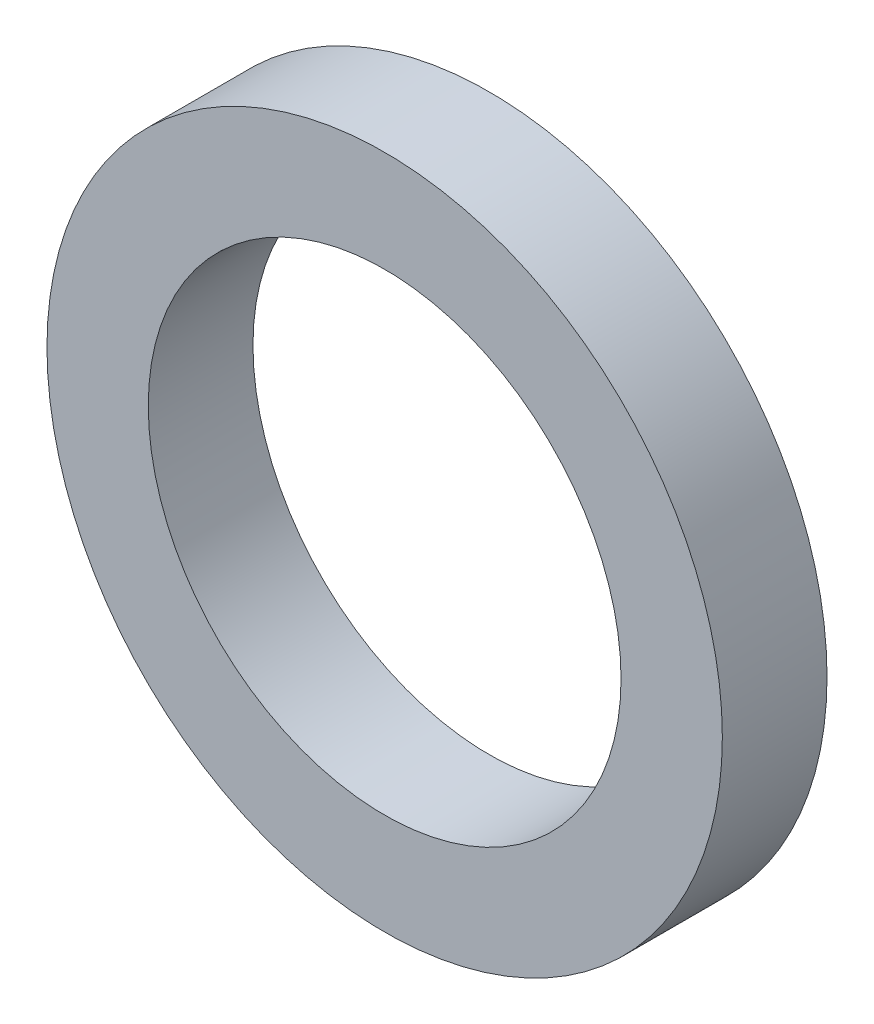
ISO-10303-21;
HEADER;
FILE_DESCRIPTION(('STEP AP214'),'2;1');
FILE_NAME('part.step','',(''),(''),'','','');
FILE_SCHEMA(('AUTOMOTIVE_DESIGN { 1 0 10303 214 1 1 1 1 }'));
ENDSEC;
DATA;
#1=APPLICATION_CONTEXT('core data for automotive mechanical design processes');
#2=APPLICATION_PROTOCOL_DEFINITION('international standard','automotive_design',2000,#1);
#3=PRODUCT_CONTEXT('',#1,'mechanical');
#4=PRODUCT('Part','Part','',(#3));
#5=PRODUCT_RELATED_PRODUCT_CATEGORY('part','',(#4));
#6=PRODUCT_DEFINITION_FORMATION('','',#4);
#7=PRODUCT_DEFINITION_CONTEXT('part definition',#1,'design');
#8=PRODUCT_DEFINITION('design','',#6,#7);
#9=PRODUCT_DEFINITION_SHAPE('','',#8);
#10=(LENGTH_UNIT() NAMED_UNIT(*) SI_UNIT(.MILLI.,.METRE.));
#11=(NAMED_UNIT(*) PLANE_ANGLE_UNIT() SI_UNIT($,.RADIAN.));
#12=(NAMED_UNIT(*) SI_UNIT($,.STERADIAN.) SOLID_ANGLE_UNIT());
#13=UNCERTAINTY_MEASURE_WITH_UNIT(LENGTH_MEASURE(1.E-05),#10,'distance_accuracy_value','');
#14=(GEOMETRIC_REPRESENTATION_CONTEXT(3) GLOBAL_UNCERTAINTY_ASSIGNED_CONTEXT((#13)) GLOBAL_UNIT_ASSIGNED_CONTEXT((#10,
#11,#12)) REPRESENTATION_CONTEXT('',''));
#15=CARTESIAN_POINT('',(0.,0.,0.));
#16=DIRECTION('',(0.,0.,1.));
#17=DIRECTION('',(1.,0.,0.));
#18=AXIS2_PLACEMENT_3D('',#15,#16,#17);
#19=CARTESIAN_POINT('',(0.,0.,3.1));
#20=DIRECTION('',(0.,0.,1.));
#21=DIRECTION('',(1.,0.,0.));
#22=AXIS2_PLACEMENT_3D('',#19,#20,#21);
#23=PLANE('',#22);
#24=CARTESIAN_POINT('',(0.,0.,3.1));
#25=DIRECTION('',(0.,0.,1.));
#26=DIRECTION('',(1.,0.,0.));
#27=AXIS2_PLACEMENT_3D('',#24,#25,#26);
#28=CIRCLE('',#27,20.);
#29=CARTESIAN_POINT('',(-20.,0.,3.1));
#30=VERTEX_POINT('',#29);
#31=EDGE_CURVE('E10',#30,#30,#28,.T.);
#32=ORIENTED_EDGE('',*,*,#31,.T.);
#33=EDGE_LOOP('',(#32));
#34=FACE_BOUND('',#33,.T.);
#35=CARTESIAN_POINT('',(0.,0.,3.1));
#36=DIRECTION('',(0.,0.,1.));
#37=DIRECTION('',(1.,0.,0.));
#38=AXIS2_PLACEMENT_3D('',#35,#36,#37);
#39=CIRCLE('',#38,14.);
#40=CARTESIAN_POINT('',(-14.,0.,3.1));
#41=VERTEX_POINT('',#40);
#42=EDGE_CURVE('E43',#41,#41,#39,.T.);
#43=ORIENTED_EDGE('',*,*,#42,.F.);
#44=EDGE_LOOP('',(#43));
#45=FACE_BOUND('',#44,.T.);
#46=ADVANCED_FACE('F32',(#34,#45),#23,.T.);
#47=CARTESIAN_POINT('',(0.,0.,-3.1));
#48=DIRECTION('',(0.,0.,1.));
#49=DIRECTION('',(1.,0.,0.));
#50=AXIS2_PLACEMENT_3D('',#47,#48,#49);
#51=PLANE('',#50);
#52=CARTESIAN_POINT('',(0.,0.,-3.1));
#53=DIRECTION('',(0.,0.,1.));
#54=DIRECTION('',(1.,0.,0.));
#55=AXIS2_PLACEMENT_3D('',#52,#53,#54);
#56=CIRCLE('',#55,20.);
#57=CARTESIAN_POINT('',(-20.,0.,-3.1));
#58=VERTEX_POINT('',#57);
#59=EDGE_CURVE('E36',#58,#58,#56,.T.);
#60=ORIENTED_EDGE('',*,*,#59,.F.);
#61=EDGE_LOOP('',(#60));
#62=FACE_BOUND('',#61,.T.);
#63=CARTESIAN_POINT('',(0.,0.,-3.1));
#64=DIRECTION('',(0.,0.,1.));
#65=DIRECTION('',(1.,0.,0.));
#66=AXIS2_PLACEMENT_3D('',#63,#64,#65);
#67=CIRCLE('',#66,14.);
#68=CARTESIAN_POINT('',(-14.,0.,-3.1));
#69=VERTEX_POINT('',#68);
#70=EDGE_CURVE('E45',#69,#69,#67,.T.);
#71=ORIENTED_EDGE('',*,*,#70,.T.);
#72=EDGE_LOOP('',(#71));
#73=FACE_BOUND('',#72,.T.);
#74=ADVANCED_FACE('F55',(#62,#73),#51,.F.);
#75=CARTESIAN_POINT('',(0.,0.,3.1));
#76=DIRECTION('',(0.,0.,-1.));
#77=DIRECTION('',(-1.,0.,0.));
#78=AXIS2_PLACEMENT_3D('',#75,#76,#77);
#79=CYLINDRICAL_SURFACE('',#78,20.);
#80=CARTESIAN_POINT('',(-20.,0.,3.1));
#81=CARTESIAN_POINT('',(-20.,0.,3.03541666666667));
#82=CARTESIAN_POINT('',(-20.,0.,2.97083333333333));
#83=CARTESIAN_POINT('',(-20.,0.,2.84166666666667));
#84=CARTESIAN_POINT('',(-20.,0.,2.77708333333333));
#85=CARTESIAN_POINT('',(-20.,0.,2.64791666666667));
#86=CARTESIAN_POINT('',(-20.,0.,2.58333333333333));
#87=CARTESIAN_POINT('',(-20.,0.,2.45416666666667));
#88=CARTESIAN_POINT('',(-20.,0.,2.38958333333333));
#89=CARTESIAN_POINT('',(-20.,0.,2.26041666666667));
#90=CARTESIAN_POINT('',(-20.,0.,2.19583333333333));
#91=CARTESIAN_POINT('',(-20.,0.,2.06666666666667));
#92=CARTESIAN_POINT('',(-20.,0.,2.00208333333333));
#93=CARTESIAN_POINT('',(-20.,0.,1.87291666666667));
#94=CARTESIAN_POINT('',(-20.,0.,1.80833333333333));
#95=CARTESIAN_POINT('',(-20.,0.,1.67916666666667));
#96=CARTESIAN_POINT('',(-20.,0.,1.61458333333333));
#97=CARTESIAN_POINT('',(-20.,0.,1.48541666666667));
#98=CARTESIAN_POINT('',(-20.,0.,1.42083333333333));
#99=CARTESIAN_POINT('',(-20.,0.,1.29166666666667));
#100=CARTESIAN_POINT('',(-20.,0.,1.22708333333333));
#101=CARTESIAN_POINT('',(-20.,0.,1.09791666666667));
#102=CARTESIAN_POINT('',(-20.,0.,1.03333333333333));
#103=CARTESIAN_POINT('',(-20.,0.,0.904166666666666));
#104=CARTESIAN_POINT('',(-20.,0.,0.839583333333333));
#105=CARTESIAN_POINT('',(-20.,0.,0.710416666666666));
#106=CARTESIAN_POINT('',(-20.,0.,0.645833333333333));
#107=CARTESIAN_POINT('',(-20.,0.,0.516666666666666));
#108=CARTESIAN_POINT('',(-20.,0.,0.452083333333333));
#109=CARTESIAN_POINT('',(-20.,0.,0.322916666666666));
#110=CARTESIAN_POINT('',(-20.,0.,0.258333333333333));
#111=CARTESIAN_POINT('',(-20.,0.,0.129166666666666));
#112=CARTESIAN_POINT('',(-20.,0.,0.0645833333333329));
#113=CARTESIAN_POINT('',(-20.,0.,-0.0645833333333337));
#114=CARTESIAN_POINT('',(-20.,0.,-0.129166666666667));
#115=CARTESIAN_POINT('',(-20.,0.,-0.258333333333334));
#116=CARTESIAN_POINT('',(-20.,0.,-0.322916666666667));
#117=CARTESIAN_POINT('',(-20.,0.,-0.452083333333334));
#118=CARTESIAN_POINT('',(-20.,0.,-0.516666666666667));
#119=CARTESIAN_POINT('',(-20.,0.,-0.645833333333334));
#120=CARTESIAN_POINT('',(-20.,0.,-0.710416666666667));
#121=CARTESIAN_POINT('',(-20.,0.,-0.839583333333333));
#122=CARTESIAN_POINT('',(-20.,0.,-0.904166666666667));
#123=CARTESIAN_POINT('',(-20.,0.,-1.03333333333333));
#124=CARTESIAN_POINT('',(-20.,0.,-1.09791666666667));
#125=CARTESIAN_POINT('',(-20.,0.,-1.22708333333333));
#126=CARTESIAN_POINT('',(-20.,0.,-1.29166666666667));
#127=CARTESIAN_POINT('',(-20.,0.,-1.42083333333333));
#128=CARTESIAN_POINT('',(-20.,0.,-1.48541666666667));
#129=CARTESIAN_POINT('',(-20.,0.,-1.61458333333333));
#130=CARTESIAN_POINT('',(-20.,0.,-1.67916666666667));
#131=CARTESIAN_POINT('',(-20.,0.,-1.80833333333333));
#132=CARTESIAN_POINT('',(-20.,0.,-1.87291666666667));
#133=CARTESIAN_POINT('',(-20.,0.,-2.00208333333333));
#134=CARTESIAN_POINT('',(-20.,0.,-2.06666666666667));
#135=CARTESIAN_POINT('',(-20.,0.,-2.19583333333333));
#136=CARTESIAN_POINT('',(-20.,0.,-2.26041666666667));
#137=CARTESIAN_POINT('',(-20.,0.,-2.38958333333333));
#138=CARTESIAN_POINT('',(-20.,0.,-2.45416666666667));
#139=CARTESIAN_POINT('',(-20.,0.,-2.58333333333333));
#140=CARTESIAN_POINT('',(-20.,0.,-2.64791666666667));
#141=CARTESIAN_POINT('',(-20.,0.,-2.77708333333333));
#142=CARTESIAN_POINT('',(-20.,0.,-2.84166666666667));
#143=CARTESIAN_POINT('',(-20.,0.,-2.97083333333333));
#144=CARTESIAN_POINT('',(-20.,0.,-3.03541666666667));
#145=CARTESIAN_POINT('',(-20.,0.,-3.1));
#146=B_SPLINE_CURVE_WITH_KNOTS('',3,(#80,#81,#82,#83,#84,#85,#86,#87,#88,#89,#90,#91,#92,#93,
#94,#95,#96,#97,#98,#99,#100,#101,#102,#103,#104,#105,#106,#107,#108,#109,#110,#111,#112,#113,
#114,#115,#116,#117,#118,#119,#120,#121,#122,#123,#124,#125,#126,#127,#128,#129,#130,#131,#132,
#133,#134,#135,#136,#137,#138,#139,#140,#141,#142,#143,#144,#145),.UNSPECIFIED.,.F.,.F.,(4,2,2,
2,2,2,2,2,2,2,2,2,2,2,2,2,2,2,2,2,2,2,2,2,2,2,2,2,2,2,2,2,4),(0.,0.19375,0.3875,0.58125,0.775,
0.96875,1.1625,1.35625,1.55,1.74375,1.9375,2.13125,2.325,2.51875,2.7125,2.90625,3.1,3.29375,
3.4875,3.68125,3.875,4.06875,4.2625,4.45625,4.65,4.84375,5.0375,5.23125,5.425,5.61875,5.8125,
6.00625,6.2),.UNSPECIFIED.);
#147=EDGE_CURVE('BSEAM34',#30,#58,#146,.T.);
#148=ORIENTED_EDGE('',*,*,#31,.F.);
#149=ORIENTED_EDGE('',*,*,#59,.T.);
#150=ORIENTED_EDGE('',*,*,#147,.T.);
#151=ORIENTED_EDGE('',*,*,#147,.F.);
#152=EDGE_LOOP('',(#148,#150,#149,#151));
#153=FACE_BOUND('',#152,.T.);
#154=ADVANCED_FACE('F34',(#153),#79,.T.);
#155=CARTESIAN_POINT('',(0.,0.,3.1));
#156=DIRECTION('',(0.,0.,-1.));
#157=DIRECTION('',(-1.,0.,0.));
#158=AXIS2_PLACEMENT_3D('',#155,#156,#157);
#159=CYLINDRICAL_SURFACE('',#158,14.);
#160=CARTESIAN_POINT('',(-14.,0.,3.1));
#161=CARTESIAN_POINT('',(-14.,0.,3.03541666666667));
#162=CARTESIAN_POINT('',(-14.,0.,2.97083333333333));
#163=CARTESIAN_POINT('',(-14.,0.,2.84166666666667));
#164=CARTESIAN_POINT('',(-14.,0.,2.77708333333333));
#165=CARTESIAN_POINT('',(-14.,0.,2.64791666666667));
#166=CARTESIAN_POINT('',(-14.,0.,2.58333333333333));
#167=CARTESIAN_POINT('',(-14.,0.,2.45416666666667));
#168=CARTESIAN_POINT('',(-14.,0.,2.38958333333333));
#169=CARTESIAN_POINT('',(-14.,0.,2.26041666666667));
#170=CARTESIAN_POINT('',(-14.,0.,2.19583333333333));
#171=CARTESIAN_POINT('',(-14.,0.,2.06666666666667));
#172=CARTESIAN_POINT('',(-14.,0.,2.00208333333333));
#173=CARTESIAN_POINT('',(-14.,0.,1.87291666666667));
#174=CARTESIAN_POINT('',(-14.,0.,1.80833333333333));
#175=CARTESIAN_POINT('',(-14.,0.,1.67916666666667));
#176=CARTESIAN_POINT('',(-14.,0.,1.61458333333333));
#177=CARTESIAN_POINT('',(-14.,0.,1.48541666666667));
#178=CARTESIAN_POINT('',(-14.,0.,1.42083333333333));
#179=CARTESIAN_POINT('',(-14.,0.,1.29166666666667));
#180=CARTESIAN_POINT('',(-14.,0.,1.22708333333333));
#181=CARTESIAN_POINT('',(-14.,0.,1.09791666666667));
#182=CARTESIAN_POINT('',(-14.,0.,1.03333333333333));
#183=CARTESIAN_POINT('',(-14.,0.,0.904166666666667));
#184=CARTESIAN_POINT('',(-14.,0.,0.839583333333333));
#185=CARTESIAN_POINT('',(-14.,0.,0.710416666666667));
#186=CARTESIAN_POINT('',(-14.,0.,0.645833333333333));
#187=CARTESIAN_POINT('',(-14.,0.,0.516666666666667));
#188=CARTESIAN_POINT('',(-14.,0.,0.452083333333333));
#189=CARTESIAN_POINT('',(-14.,0.,0.322916666666667));
#190=CARTESIAN_POINT('',(-14.,0.,0.258333333333333));
#191=CARTESIAN_POINT('',(-14.,0.,0.129166666666667));
#192=CARTESIAN_POINT('',(-14.,0.,0.0645833333333333));
#193=CARTESIAN_POINT('',(-14.,0.,-0.0645833333333333));
#194=CARTESIAN_POINT('',(-14.,0.,-0.129166666666667));
#195=CARTESIAN_POINT('',(-14.,0.,-0.258333333333333));
#196=CARTESIAN_POINT('',(-14.,0.,-0.322916666666667));
#197=CARTESIAN_POINT('',(-14.,0.,-0.452083333333333));
#198=CARTESIAN_POINT('',(-14.,0.,-0.516666666666667));
#199=CARTESIAN_POINT('',(-14.,0.,-0.645833333333333));
#200=CARTESIAN_POINT('',(-14.,0.,-0.710416666666667));
#201=CARTESIAN_POINT('',(-14.,0.,-0.839583333333333));
#202=CARTESIAN_POINT('',(-14.,0.,-0.904166666666666));
#203=CARTESIAN_POINT('',(-14.,0.,-1.03333333333333));
#204=CARTESIAN_POINT('',(-14.,0.,-1.09791666666667));
#205=CARTESIAN_POINT('',(-14.,0.,-1.22708333333333));
#206=CARTESIAN_POINT('',(-14.,0.,-1.29166666666667));
#207=CARTESIAN_POINT('',(-14.,0.,-1.42083333333333));
#208=CARTESIAN_POINT('',(-14.,0.,-1.48541666666667));
#209=CARTESIAN_POINT('',(-14.,0.,-1.61458333333333));
#210=CARTESIAN_POINT('',(-14.,0.,-1.67916666666667));
#211=CARTESIAN_POINT('',(-14.,0.,-1.80833333333333));
#212=CARTESIAN_POINT('',(-14.,0.,-1.87291666666667));
#213=CARTESIAN_POINT('',(-14.,0.,-2.00208333333333));
#214=CARTESIAN_POINT('',(-14.,0.,-2.06666666666667));
#215=CARTESIAN_POINT('',(-14.,0.,-2.19583333333333));
#216=CARTESIAN_POINT('',(-14.,0.,-2.26041666666667));
#217=CARTESIAN_POINT('',(-14.,0.,-2.38958333333333));
#218=CARTESIAN_POINT('',(-14.,0.,-2.45416666666667));
#219=CARTESIAN_POINT('',(-14.,0.,-2.58333333333333));
#220=CARTESIAN_POINT('',(-14.,0.,-2.64791666666667));
#221=CARTESIAN_POINT('',(-14.,0.,-2.77708333333333));
#222=CARTESIAN_POINT('',(-14.,0.,-2.84166666666667));
#223=CARTESIAN_POINT('',(-14.,0.,-2.97083333333333));
#224=CARTESIAN_POINT('',(-14.,0.,-3.03541666666667));
#225=CARTESIAN_POINT('',(-14.,0.,-3.1));
#226=B_SPLINE_CURVE_WITH_KNOTS('',3,(#160,#161,#162,#163,#164,#165,#166,#167,#168,#169,#170,
#171,#172,#173,#174,#175,#176,#177,#178,#179,#180,#181,#182,#183,#184,#185,#186,#187,#188,#189,
#190,#191,#192,#193,#194,#195,#196,#197,#198,#199,#200,#201,#202,#203,#204,#205,#206,#207,#208,
#209,#210,#211,#212,#213,#214,#215,#216,#217,#218,#219,#220,#221,#222,#223,#224,#225),
.UNSPECIFIED.,.F.,.F.,(4,2,2,2,2,2,2,2,2,2,2,2,2,2,2,2,2,2,2,2,2,2,2,2,2,2,2,2,2,2,2,2,4),(0.,
0.19375,0.3875,0.58125,0.775,0.96875,1.1625,1.35625,1.55,1.74375,1.9375,2.13125,2.325,2.51875,
2.7125,2.90625,3.1,3.29375,3.4875,3.68125,3.875,4.06875,4.2625,4.45625,4.65,4.84375,5.0375,
5.23125,5.425,5.61875,5.8125,6.00625,6.2),.UNSPECIFIED.);
#227=EDGE_CURVE('BSEAM51',#41,#69,#226,.T.);
#228=ORIENTED_EDGE('',*,*,#42,.T.);
#229=ORIENTED_EDGE('',*,*,#70,.F.);
#230=ORIENTED_EDGE('',*,*,#227,.T.);
#231=ORIENTED_EDGE('',*,*,#227,.F.);
#232=EDGE_LOOP('',(#228,#230,#229,#231));
#233=FACE_BOUND('',#232,.T.);
#234=ADVANCED_FACE('F51',(#233),#159,.F.);
#235=CLOSED_SHELL('',(#46,#74,#154,#234));
#236=MANIFOLD_SOLID_BREP('B2',#235);
#237=ADVANCED_BREP_SHAPE_REPRESENTATION('',(#18,#236),#14);
#238=SHAPE_DEFINITION_REPRESENTATION(#9,#237);
ENDSEC;
END-ISO-10303-21;
